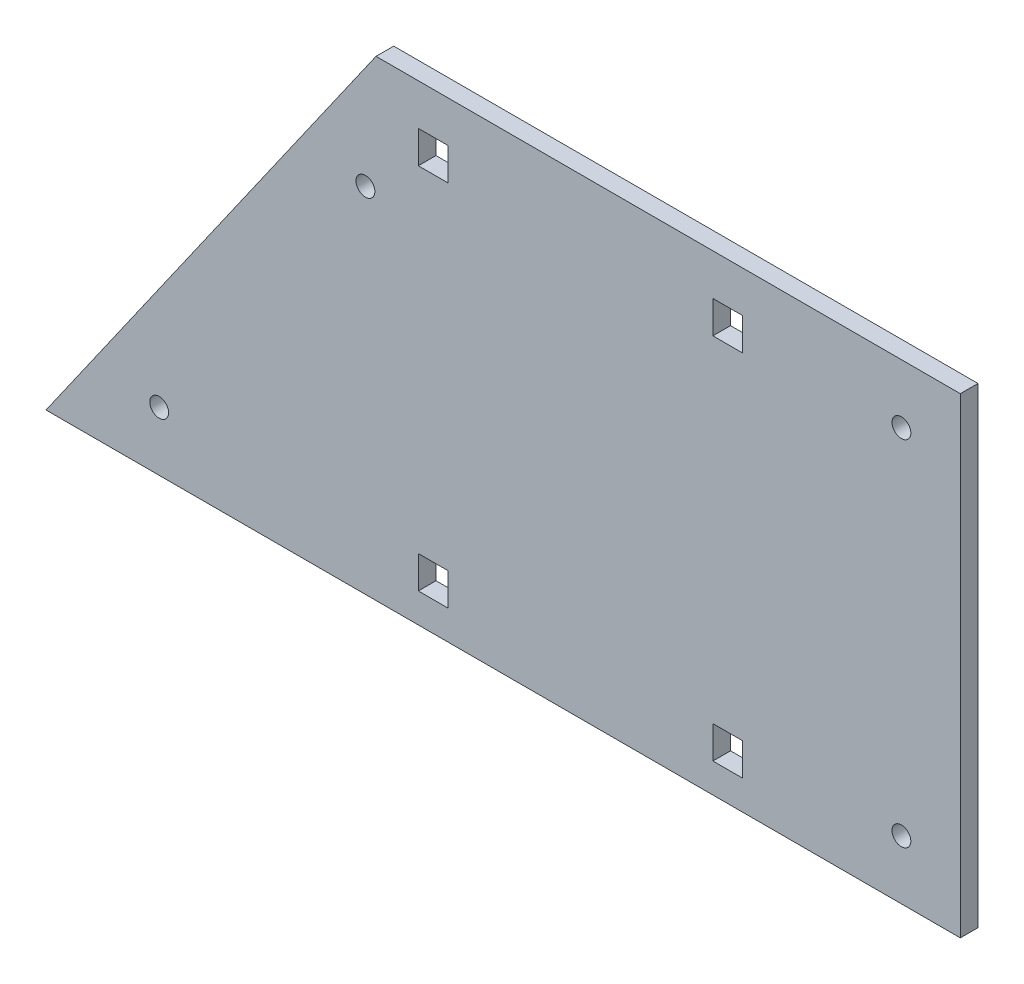
ISO-10303-21;
HEADER;
FILE_DESCRIPTION(('STEP AP214'),'2;1');
FILE_NAME('part.step','',(''),(''),'','','');
FILE_SCHEMA(('AUTOMOTIVE_DESIGN { 1 0 10303 214 1 1 1 1 }'));
ENDSEC;
DATA;
#1=APPLICATION_CONTEXT('core data for automotive mechanical design processes');
#2=APPLICATION_PROTOCOL_DEFINITION('international standard','automotive_design',2000,#1);
#3=PRODUCT_CONTEXT('',#1,'mechanical');
#4=PRODUCT('Part','Part','',(#3));
#5=PRODUCT_RELATED_PRODUCT_CATEGORY('part','',(#4));
#6=PRODUCT_DEFINITION_FORMATION('','',#4);
#7=PRODUCT_DEFINITION_CONTEXT('part definition',#1,'design');
#8=PRODUCT_DEFINITION('design','',#6,#7);
#9=PRODUCT_DEFINITION_SHAPE('','',#8);
#10=(LENGTH_UNIT() NAMED_UNIT(*) SI_UNIT(.MILLI.,.METRE.));
#11=(NAMED_UNIT(*) PLANE_ANGLE_UNIT() SI_UNIT($,.RADIAN.));
#12=(NAMED_UNIT(*) SI_UNIT($,.STERADIAN.) SOLID_ANGLE_UNIT());
#13=UNCERTAINTY_MEASURE_WITH_UNIT(LENGTH_MEASURE(1.E-05),#10,'distance_accuracy_value','');
#14=(GEOMETRIC_REPRESENTATION_CONTEXT(3) GLOBAL_UNCERTAINTY_ASSIGNED_CONTEXT((#13)) GLOBAL_UNIT_ASSIGNED_CONTEXT((#10,
#11,#12)) REPRESENTATION_CONTEXT('',''));
#15=CARTESIAN_POINT('',(0.,0.,0.));
#16=DIRECTION('',(0.,0.,1.));
#17=DIRECTION('',(1.,0.,0.));
#18=AXIS2_PLACEMENT_3D('',#15,#16,#17);
#19=CARTESIAN_POINT('',(0.,0.,3.));
#20=DIRECTION('',(0.,0.,1.));
#21=DIRECTION('',(1.,0.,0.));
#22=AXIS2_PLACEMENT_3D('',#19,#20,#21);
#23=PLANE('',#22);
#24=DIRECTION('',(0.,1.,0.));
#25=VECTOR('',#24,1.);
#26=CARTESIAN_POINT('',(100.749999999974,-37.749999999997,3.));
#27=LINE('',#26,#25);
#28=CARTESIAN_POINT('',(100.749999999974,-37.749999999997,3.));
#29=VERTEX_POINT('',#28);
#30=CARTESIAN_POINT('',(100.749999999974,-32.249999999997,3.));
#31=VERTEX_POINT('',#30);
#32=EDGE_CURVE('E50',#29,#31,#27,.T.);
#33=ORIENTED_EDGE('',*,*,#32,.F.);
#34=DIRECTION('',(1.,0.,0.));
#35=VECTOR('',#34,1.);
#36=CARTESIAN_POINT('',(100.749999999974,-37.749999999997,3.));
#37=LINE('',#36,#35);
#38=CARTESIAN_POINT('',(95.749999999974,-37.749999999997,3.));
#39=VERTEX_POINT('',#38);
#40=EDGE_CURVE('E195',#39,#29,#37,.T.);
#41=ORIENTED_EDGE('',*,*,#40,.F.);
#42=DIRECTION('',(0.,-1.,0.));
#43=VECTOR('',#42,1.);
#44=CARTESIAN_POINT('',(95.749999999974,-37.749999999997,3.));
#45=LINE('',#44,#43);
#46=CARTESIAN_POINT('',(95.749999999974,-32.249999999997,3.));
#47=VERTEX_POINT('',#46);
#48=EDGE_CURVE('E179',#47,#39,#45,.T.);
#49=ORIENTED_EDGE('',*,*,#48,.F.);
#50=DIRECTION('',(-1.,0.,0.));
#51=VECTOR('',#50,1.);
#52=CARTESIAN_POINT('',(100.749999999974,-32.249999999997,3.));
#53=LINE('',#52,#51);
#54=EDGE_CURVE('E189',#31,#47,#53,.T.);
#55=ORIENTED_EDGE('',*,*,#54,.F.);
#56=EDGE_LOOP('',(#33,#41,#49,#55));
#57=FACE_BOUND('',#56,.T.);
#58=DIRECTION('',(0.,1.,0.));
#59=VECTOR('',#58,1.);
#60=CARTESIAN_POINT('',(50.7499999999738,-37.7499999999971,3.));
#61=LINE('',#60,#59);
#62=CARTESIAN_POINT('',(50.7499999999738,-37.7499999999971,3.));
#63=VERTEX_POINT('',#62);
#64=CARTESIAN_POINT('',(50.7499999999738,-32.2499999999971,3.));
#65=VERTEX_POINT('',#64);
#66=EDGE_CURVE('E58',#63,#65,#61,.T.);
#67=ORIENTED_EDGE('',*,*,#66,.F.);
#68=DIRECTION('',(1.,0.,0.));
#69=VECTOR('',#68,1.);
#70=CARTESIAN_POINT('',(50.7499999999738,-37.7499999999971,3.));
#71=LINE('',#70,#69);
#72=CARTESIAN_POINT('',(45.7499999999738,-37.7499999999971,3.));
#73=VERTEX_POINT('',#72);
#74=EDGE_CURVE('E212',#73,#63,#71,.T.);
#75=ORIENTED_EDGE('',*,*,#74,.F.);
#76=DIRECTION('',(0.,-1.,0.));
#77=VECTOR('',#76,1.);
#78=CARTESIAN_POINT('',(45.7499999999738,-37.7499999999971,3.));
#79=LINE('',#78,#77);
#80=CARTESIAN_POINT('',(45.7499999999738,-32.2499999999971,3.));
#81=VERTEX_POINT('',#80);
#82=EDGE_CURVE('E209',#81,#73,#79,.T.);
#83=ORIENTED_EDGE('',*,*,#82,.F.);
#84=DIRECTION('',(-1.,0.,0.));
#85=VECTOR('',#84,1.);
#86=CARTESIAN_POINT('',(50.7499999999738,-32.2499999999971,3.));
#87=LINE('',#86,#85);
#88=EDGE_CURVE('E206',#65,#81,#87,.T.);
#89=ORIENTED_EDGE('',*,*,#88,.F.);
#90=EDGE_LOOP('',(#67,#75,#83,#89));
#91=FACE_BOUND('',#90,.T.);
#92=DIRECTION('',(0.,1.,0.));
#93=VECTOR('',#92,1.);
#94=CARTESIAN_POINT('',(100.749999999972,-100.249999999997,3.));
#95=LINE('',#94,#93);
#96=CARTESIAN_POINT('',(100.749999999972,-100.249999999997,3.));
#97=VERTEX_POINT('',#96);
#98=CARTESIAN_POINT('',(100.749999999972,-94.749999999997,3.));
#99=VERTEX_POINT('',#98);
#100=EDGE_CURVE('E223',#97,#99,#95,.T.);
#101=ORIENTED_EDGE('',*,*,#100,.F.);
#102=DIRECTION('',(1.,0.,0.));
#103=VECTOR('',#102,1.);
#104=CARTESIAN_POINT('',(100.749999999972,-100.249999999997,3.));
#105=LINE('',#104,#103);
#106=CARTESIAN_POINT('',(95.7499999999715,-100.249999999997,3.));
#107=VERTEX_POINT('',#106);
#108=EDGE_CURVE('E232',#107,#97,#105,.T.);
#109=ORIENTED_EDGE('',*,*,#108,.F.);
#110=DIRECTION('',(0.,-1.,0.));
#111=VECTOR('',#110,1.);
#112=CARTESIAN_POINT('',(95.7499999999715,-100.249999999997,3.));
#113=LINE('',#112,#111);
#114=CARTESIAN_POINT('',(95.7499999999715,-94.749999999997,3.));
#115=VERTEX_POINT('',#114);
#116=EDGE_CURVE('E229',#115,#107,#113,.T.);
#117=ORIENTED_EDGE('',*,*,#116,.F.);
#118=DIRECTION('',(-1.,0.,0.));
#119=VECTOR('',#118,1.);
#120=CARTESIAN_POINT('',(100.749999999972,-94.749999999997,3.));
#121=LINE('',#120,#119);
#122=EDGE_CURVE('E225',#99,#115,#121,.T.);
#123=ORIENTED_EDGE('',*,*,#122,.F.);
#124=EDGE_LOOP('',(#101,#109,#117,#123));
#125=FACE_BOUND('',#124,.T.);
#126=DIRECTION('',(0.,1.,0.));
#127=VECTOR('',#126,1.);
#128=CARTESIAN_POINT('',(50.7499999999713,-100.249999999997,3.));
#129=LINE('',#128,#127);
#130=CARTESIAN_POINT('',(50.7499999999713,-100.249999999997,3.));
#131=VERTEX_POINT('',#130);
#132=CARTESIAN_POINT('',(50.7499999999713,-94.7499999999971,3.));
#133=VERTEX_POINT('',#132);
#134=EDGE_CURVE('E202',#131,#133,#129,.T.);
#135=ORIENTED_EDGE('',*,*,#134,.F.);
#136=DIRECTION('',(1.,0.,0.));
#137=VECTOR('',#136,1.);
#138=CARTESIAN_POINT('',(50.7499999999713,-100.249999999997,3.));
#139=LINE('',#138,#137);
#140=CARTESIAN_POINT('',(45.7499999999713,-100.249999999997,3.));
#141=VERTEX_POINT('',#140);
#142=EDGE_CURVE('E252',#141,#131,#139,.T.);
#143=ORIENTED_EDGE('',*,*,#142,.F.);
#144=DIRECTION('',(0.,-1.,0.));
#145=VECTOR('',#144,1.);
#146=CARTESIAN_POINT('',(45.7499999999713,-100.249999999997,3.));
#147=LINE('',#146,#145);
#148=CARTESIAN_POINT('',(45.7499999999713,-94.7499999999971,3.));
#149=VERTEX_POINT('',#148);
#150=EDGE_CURVE('E249',#149,#141,#147,.T.);
#151=ORIENTED_EDGE('',*,*,#150,.F.);
#152=DIRECTION('',(-1.,0.,0.));
#153=VECTOR('',#152,1.);
#154=CARTESIAN_POINT('',(50.7499999999713,-94.7499999999971,3.));
#155=LINE('',#154,#153);
#156=EDGE_CURVE('E246',#133,#149,#155,.T.);
#157=ORIENTED_EDGE('',*,*,#156,.F.);
#158=EDGE_LOOP('',(#135,#143,#151,#157));
#159=FACE_BOUND('',#158,.T.);
#160=CARTESIAN_POINT('',(127.749999999971,-35.25,3.));
#161=DIRECTION('',(0.,0.,1.));
#162=DIRECTION('',(1.,0.,0.));
#163=AXIS2_PLACEMENT_3D('',#160,#161,#162);
#164=CIRCLE('',#163,1.59999999999999);
#165=CARTESIAN_POINT('',(129.349999999971,-35.25,3.));
#166=VERTEX_POINT('',#165);
#167=EDGE_CURVE('E269',#166,#166,#164,.T.);
#168=ORIENTED_EDGE('',*,*,#167,.F.);
#169=EDGE_LOOP('',(#168));
#170=FACE_BOUND('',#169,.T.);
#171=CARTESIAN_POINT('',(36.7735951233743,-45.2500000000001,3.));
#172=DIRECTION('',(0.,0.,1.));
#173=DIRECTION('',(1.,0.,0.));
#174=AXIS2_PLACEMENT_3D('',#171,#172,#173);
#175=CIRCLE('',#174,1.6);
#176=CARTESIAN_POINT('',(38.3735951233743,-45.2500000000001,3.));
#177=VERTEX_POINT('',#176);
#178=EDGE_CURVE('E281',#177,#177,#175,.T.);
#179=ORIENTED_EDGE('',*,*,#178,.F.);
#180=EDGE_LOOP('',(#179));
#181=FACE_BOUND('',#180,.T.);
#182=DIRECTION('',(0.,1.,0.));
#183=VECTOR('',#182,1.);
#184=CARTESIAN_POINT('',(137.749999999971,-25.25,3.));
#185=LINE('',#184,#183);
#186=CARTESIAN_POINT('',(137.749999999968,-105.25,3.));
#187=VERTEX_POINT('',#186);
#188=CARTESIAN_POINT('',(137.749999999971,-25.25,3.));
#189=VERTEX_POINT('',#188);
#190=EDGE_CURVE('E287',#187,#189,#185,.T.);
#191=ORIENTED_EDGE('',*,*,#190,.T.);
#192=DIRECTION('',(-1.,0.,0.));
#193=VECTOR('',#192,1.);
#194=CARTESIAN_POINT('',(137.749999999971,-25.25,3.));
#195=LINE('',#194,#193);
#196=CARTESIAN_POINT('',(38.569999999954,-25.25,3.));
#197=VERTEX_POINT('',#196);
#198=EDGE_CURVE('E290',#189,#197,#195,.T.);
#199=ORIENTED_EDGE('',*,*,#198,.T.);
#200=DIRECTION('',(-0.573576436351044,-0.819152044288993,0.));
#201=VECTOR('',#200,1.);
#202=CARTESIAN_POINT('',(38.569999999954,-25.25,3.));
#203=LINE('',#202,#201);
#204=CARTESIAN_POINT('',(-17.4466030568225,-105.25,3.));
#205=VERTEX_POINT('',#204);
#206=EDGE_CURVE('E293',#197,#205,#203,.T.);
#207=ORIENTED_EDGE('',*,*,#206,.T.);
#208=DIRECTION('',(1.,0.,0.));
#209=VECTOR('',#208,1.);
#210=CARTESIAN_POINT('',(-17.4466030568225,-105.25,3.));
#211=LINE('',#210,#209);
#212=EDGE_CURVE('E295',#205,#187,#211,.T.);
#213=ORIENTED_EDGE('',*,*,#212,.T.);
#214=EDGE_LOOP('',(#191,#199,#207,#213));
#215=FACE_BOUND('',#214,.T.);
#216=CARTESIAN_POINT('',(1.76321821288909,-95.25,3.));
#217=DIRECTION('',(0.,0.,1.));
#218=DIRECTION('',(1.,0.,0.));
#219=AXIS2_PLACEMENT_3D('',#216,#217,#218);
#220=CIRCLE('',#219,1.60000000000001);
#221=CARTESIAN_POINT('',(3.36321821288909,-95.25,3.));
#222=VERTEX_POINT('',#221);
#223=EDGE_CURVE('E275',#222,#222,#220,.T.);
#224=ORIENTED_EDGE('',*,*,#223,.F.);
#225=EDGE_LOOP('',(#224));
#226=FACE_BOUND('',#225,.T.);
#227=CARTESIAN_POINT('',(127.749999999971,-95.25,3.));
#228=DIRECTION('',(0.,0.,1.));
#229=DIRECTION('',(1.,0.,0.));
#230=AXIS2_PLACEMENT_3D('',#227,#228,#229);
#231=CIRCLE('',#230,1.59999999999999);
#232=CARTESIAN_POINT('',(129.349999999971,-95.25,3.));
#233=VERTEX_POINT('',#232);
#234=EDGE_CURVE('E263',#233,#233,#231,.T.);
#235=ORIENTED_EDGE('',*,*,#234,.F.);
#236=EDGE_LOOP('',(#235));
#237=FACE_BOUND('',#236,.T.);
#238=ADVANCED_FACE('F35',(#57,#91,#125,#159,#170,#181,#215,#226,#237),#23,.T.);
#239=CARTESIAN_POINT('',(0.,0.,0.));
#240=DIRECTION('',(0.,0.,1.));
#241=DIRECTION('',(1.,0.,0.));
#242=AXIS2_PLACEMENT_3D('',#239,#240,#241);
#243=PLANE('',#242);
#244=DIRECTION('',(1.,0.,0.));
#245=VECTOR('',#244,1.);
#246=CARTESIAN_POINT('',(0.,-37.749999999997,0.));
#247=LINE('',#246,#245);
#248=CARTESIAN_POINT('',(95.749999999974,-37.749999999997,0.));
#249=VERTEX_POINT('',#248);
#250=CARTESIAN_POINT('',(100.749999999974,-37.749999999997,0.));
#251=VERTEX_POINT('',#250);
#252=EDGE_CURVE('E43',#249,#251,#247,.T.);
#253=ORIENTED_EDGE('',*,*,#252,.T.);
#254=DIRECTION('',(0.,1.,0.));
#255=VECTOR('',#254,1.);
#256=CARTESIAN_POINT('',(100.749999999974,0.,0.));
#257=LINE('',#256,#255);
#258=CARTESIAN_POINT('',(100.749999999974,-32.249999999997,0.));
#259=VERTEX_POINT('',#258);
#260=EDGE_CURVE('E11',#251,#259,#257,.T.);
#261=ORIENTED_EDGE('',*,*,#260,.T.);
#262=DIRECTION('',(-1.,0.,0.));
#263=VECTOR('',#262,1.);
#264=CARTESIAN_POINT('',(1.79023462720793E-13,-32.2499999999975,0.));
#265=LINE('',#264,#263);
#266=CARTESIAN_POINT('',(95.749999999974,-32.249999999997,0.));
#267=VERTEX_POINT('',#266);
#268=EDGE_CURVE('E352',#259,#267,#265,.T.);
#269=ORIENTED_EDGE('',*,*,#268,.T.);
#270=DIRECTION('',(0.,-1.,0.));
#271=VECTOR('',#270,1.);
#272=CARTESIAN_POINT('',(95.749999999974,0.,0.));
#273=LINE('',#272,#271);
#274=EDGE_CURVE('E182',#267,#249,#273,.T.);
#275=ORIENTED_EDGE('',*,*,#274,.T.);
#276=EDGE_LOOP('',(#253,#261,#269,#275));
#277=FACE_BOUND('',#276,.T.);
#278=DIRECTION('',(1.,0.,0.));
#279=VECTOR('',#278,1.);
#280=CARTESIAN_POINT('',(-2.0955459589798E-13,-37.7499999999969,0.));
#281=LINE('',#280,#279);
#282=CARTESIAN_POINT('',(45.7499999999738,-37.7499999999971,0.));
#283=VERTEX_POINT('',#282);
#284=CARTESIAN_POINT('',(50.7499999999738,-37.7499999999971,0.));
#285=VERTEX_POINT('',#284);
#286=EDGE_CURVE('E346',#283,#285,#281,.T.);
#287=ORIENTED_EDGE('',*,*,#286,.T.);
#288=DIRECTION('',(0.,1.,0.));
#289=VECTOR('',#288,1.);
#290=CARTESIAN_POINT('',(50.7499999999738,0.,0.));
#291=LINE('',#290,#289);
#292=CARTESIAN_POINT('',(50.7499999999738,-32.2499999999971,0.));
#293=VERTEX_POINT('',#292);
#294=EDGE_CURVE('E349',#285,#293,#291,.T.);
#295=ORIENTED_EDGE('',*,*,#294,.T.);
#296=DIRECTION('',(-1.,0.,0.));
#297=VECTOR('',#296,1.);
#298=CARTESIAN_POINT('',(0.,-32.2499999999971,0.));
#299=LINE('',#298,#297);
#300=CARTESIAN_POINT('',(45.7499999999738,-32.2499999999971,0.));
#301=VERTEX_POINT('',#300);
#302=EDGE_CURVE('E340',#293,#301,#299,.T.);
#303=ORIENTED_EDGE('',*,*,#302,.T.);
#304=DIRECTION('',(0.,-1.,0.));
#305=VECTOR('',#304,1.);
#306=CARTESIAN_POINT('',(45.7499999999738,0.,0.));
#307=LINE('',#306,#305);
#308=EDGE_CURVE('E343',#301,#283,#307,.T.);
#309=ORIENTED_EDGE('',*,*,#308,.T.);
#310=EDGE_LOOP('',(#287,#295,#303,#309));
#311=FACE_BOUND('',#310,.T.);
#312=DIRECTION('',(1.,0.,0.));
#313=VECTOR('',#312,1.);
#314=CARTESIAN_POINT('',(0.,-100.249999999997,0.));
#315=LINE('',#314,#313);
#316=CARTESIAN_POINT('',(95.7499999999715,-100.249999999997,0.));
#317=VERTEX_POINT('',#316);
#318=CARTESIAN_POINT('',(100.749999999972,-100.249999999997,0.));
#319=VERTEX_POINT('',#318);
#320=EDGE_CURVE('E334',#317,#319,#315,.T.);
#321=ORIENTED_EDGE('',*,*,#320,.T.);
#322=DIRECTION('',(0.,1.,0.));
#323=VECTOR('',#322,1.);
#324=CARTESIAN_POINT('',(100.749999999972,0.,0.));
#325=LINE('',#324,#323);
#326=CARTESIAN_POINT('',(100.749999999972,-94.749999999997,0.));
#327=VERTEX_POINT('',#326);
#328=EDGE_CURVE('E337',#319,#327,#325,.T.);
#329=ORIENTED_EDGE('',*,*,#328,.T.);
#330=DIRECTION('',(-1.,0.,0.));
#331=VECTOR('',#330,1.);
#332=CARTESIAN_POINT('',(5.25968157916154E-13,-94.7499999999975,0.));
#333=LINE('',#332,#331);
#334=CARTESIAN_POINT('',(95.7499999999715,-94.749999999997,0.));
#335=VERTEX_POINT('',#334);
#336=EDGE_CURVE('E328',#327,#335,#333,.T.);
#337=ORIENTED_EDGE('',*,*,#336,.T.);
#338=DIRECTION('',(0.,-1.,0.));
#339=VECTOR('',#338,1.);
#340=CARTESIAN_POINT('',(95.7499999999715,0.,0.));
#341=LINE('',#340,#339);
#342=EDGE_CURVE('E331',#335,#317,#341,.T.);
#343=ORIENTED_EDGE('',*,*,#342,.T.);
#344=EDGE_LOOP('',(#321,#329,#337,#343));
#345=FACE_BOUND('',#344,.T.);
#346=DIRECTION('',(1.,0.,0.));
#347=VECTOR('',#346,1.);
#348=CARTESIAN_POINT('',(-5.56499291093339E-13,-100.249999999997,0.));
#349=LINE('',#348,#347);
#350=CARTESIAN_POINT('',(45.7499999999713,-100.249999999997,0.));
#351=VERTEX_POINT('',#350);
#352=CARTESIAN_POINT('',(50.7499999999713,-100.249999999997,0.));
#353=VERTEX_POINT('',#352);
#354=EDGE_CURVE('E322',#351,#353,#349,.T.);
#355=ORIENTED_EDGE('',*,*,#354,.T.);
#356=DIRECTION('',(0.,1.,0.));
#357=VECTOR('',#356,1.);
#358=CARTESIAN_POINT('',(50.7499999999713,0.,0.));
#359=LINE('',#358,#357);
#360=CARTESIAN_POINT('',(50.7499999999713,-94.7499999999971,0.));
#361=VERTEX_POINT('',#360);
#362=EDGE_CURVE('E325',#353,#361,#359,.T.);
#363=ORIENTED_EDGE('',*,*,#362,.T.);
#364=DIRECTION('',(-1.,0.,0.));
#365=VECTOR('',#364,1.);
#366=CARTESIAN_POINT('',(0.,-94.7499999999971,0.));
#367=LINE('',#366,#365);
#368=CARTESIAN_POINT('',(45.7499999999713,-94.7499999999971,0.));
#369=VERTEX_POINT('',#368);
#370=EDGE_CURVE('E316',#361,#369,#367,.T.);
#371=ORIENTED_EDGE('',*,*,#370,.T.);
#372=DIRECTION('',(0.,-1.,0.));
#373=VECTOR('',#372,1.);
#374=CARTESIAN_POINT('',(45.7499999999713,0.,0.));
#375=LINE('',#374,#373);
#376=EDGE_CURVE('E319',#369,#351,#375,.T.);
#377=ORIENTED_EDGE('',*,*,#376,.T.);
#378=EDGE_LOOP('',(#355,#363,#371,#377));
#379=FACE_BOUND('',#378,.T.);
#380=DIRECTION('',(0.,1.,0.));
#381=VECTOR('',#380,1.);
#382=CARTESIAN_POINT('',(137.749999999971,-25.25,0.));
#383=LINE('',#382,#381);
#384=CARTESIAN_POINT('',(137.749999999968,-105.25,0.));
#385=VERTEX_POINT('',#384);
#386=CARTESIAN_POINT('',(137.749999999971,-25.25,0.));
#387=VERTEX_POINT('',#386);
#388=EDGE_CURVE('E284',#385,#387,#383,.T.);
#389=ORIENTED_EDGE('',*,*,#388,.F.);
#390=DIRECTION('',(1.,0.,0.));
#391=VECTOR('',#390,1.);
#392=CARTESIAN_POINT('',(-17.4466030568225,-105.25,0.));
#393=LINE('',#392,#391);
#394=CARTESIAN_POINT('',(-17.4466030568225,-105.25,0.));
#395=VERTEX_POINT('',#394);
#396=EDGE_CURVE('E291',#395,#385,#393,.T.);
#397=ORIENTED_EDGE('',*,*,#396,.F.);
#398=DIRECTION('',(-0.573576436351044,-0.819152044288993,0.));
#399=VECTOR('',#398,1.);
#400=CARTESIAN_POINT('',(38.569999999954,-25.25,0.));
#401=LINE('',#400,#399);
#402=CARTESIAN_POINT('',(38.569999999954,-25.25,0.));
#403=VERTEX_POINT('',#402);
#404=EDGE_CURVE('E302',#403,#395,#401,.T.);
#405=ORIENTED_EDGE('',*,*,#404,.F.);
#406=DIRECTION('',(-1.,0.,0.));
#407=VECTOR('',#406,1.);
#408=CARTESIAN_POINT('',(137.749999999971,-25.25,0.));
#409=LINE('',#408,#407);
#410=EDGE_CURVE('E300',#387,#403,#409,.T.);
#411=ORIENTED_EDGE('',*,*,#410,.F.);
#412=EDGE_LOOP('',(#389,#397,#405,#411));
#413=FACE_BOUND('',#412,.T.);
#414=CARTESIAN_POINT('',(36.7735951233743,-45.2500000000001,0.));
#415=DIRECTION('',(0.,0.,1.));
#416=DIRECTION('',(1.,0.,0.));
#417=AXIS2_PLACEMENT_3D('',#414,#415,#416);
#418=CIRCLE('',#417,1.6);
#419=CARTESIAN_POINT('',(38.3735951233743,-45.2500000000001,0.));
#420=VERTEX_POINT('',#419);
#421=EDGE_CURVE('E278',#420,#420,#418,.T.);
#422=ORIENTED_EDGE('',*,*,#421,.T.);
#423=EDGE_LOOP('',(#422));
#424=FACE_BOUND('',#423,.T.);
#425=CARTESIAN_POINT('',(1.76321821288909,-95.25,0.));
#426=DIRECTION('',(0.,0.,1.));
#427=DIRECTION('',(1.,0.,0.));
#428=AXIS2_PLACEMENT_3D('',#425,#426,#427);
#429=CIRCLE('',#428,1.60000000000001);
#430=CARTESIAN_POINT('',(3.36321821288909,-95.25,0.));
#431=VERTEX_POINT('',#430);
#432=EDGE_CURVE('E272',#431,#431,#429,.T.);
#433=ORIENTED_EDGE('',*,*,#432,.T.);
#434=EDGE_LOOP('',(#433));
#435=FACE_BOUND('',#434,.T.);
#436=CARTESIAN_POINT('',(127.749999999971,-35.25,0.));
#437=DIRECTION('',(0.,0.,1.));
#438=DIRECTION('',(1.,0.,0.));
#439=AXIS2_PLACEMENT_3D('',#436,#437,#438);
#440=CIRCLE('',#439,1.59999999999999);
#441=CARTESIAN_POINT('',(129.349999999971,-35.25,0.));
#442=VERTEX_POINT('',#441);
#443=EDGE_CURVE('E266',#442,#442,#440,.T.);
#444=ORIENTED_EDGE('',*,*,#443,.T.);
#445=EDGE_LOOP('',(#444));
#446=FACE_BOUND('',#445,.T.);
#447=CARTESIAN_POINT('',(127.749999999971,-95.25,0.));
#448=DIRECTION('',(0.,0.,1.));
#449=DIRECTION('',(1.,0.,0.));
#450=AXIS2_PLACEMENT_3D('',#447,#448,#449);
#451=CIRCLE('',#450,1.59999999999999);
#452=CARTESIAN_POINT('',(129.349999999971,-95.25,0.));
#453=VERTEX_POINT('',#452);
#454=EDGE_CURVE('E238',#453,#453,#451,.T.);
#455=ORIENTED_EDGE('',*,*,#454,.T.);
#456=EDGE_LOOP('',(#455));
#457=FACE_BOUND('',#456,.T.);
#458=ADVANCED_FACE('F356',(#277,#311,#345,#379,#413,#424,#435,#446,#457),#243,.F.);
#459=CARTESIAN_POINT('',(137.749999999971,-25.25,3.));
#460=DIRECTION('',(-1.,0.,0.));
#461=DIRECTION('',(0.,-1.,0.));
#462=AXIS2_PLACEMENT_3D('',#459,#460,#461);
#463=PLANE('',#462);
#464=ORIENTED_EDGE('',*,*,#388,.T.);
#465=DIRECTION('',(0.,0.,-1.));
#466=VECTOR('',#465,1.);
#467=CARTESIAN_POINT('',(137.749999999971,-25.25,3.));
#468=LINE('',#467,#466);
#469=EDGE_CURVE('E313',#189,#387,#468,.T.);
#470=ORIENTED_EDGE('',*,*,#469,.F.);
#471=ORIENTED_EDGE('',*,*,#190,.F.);
#472=DIRECTION('',(0.,0.,-1.));
#473=VECTOR('',#472,1.);
#474=CARTESIAN_POINT('',(137.749999999968,-105.25,3.));
#475=LINE('',#474,#473);
#476=EDGE_CURVE('E297',#187,#385,#475,.T.);
#477=ORIENTED_EDGE('',*,*,#476,.T.);
#478=EDGE_LOOP('',(#464,#470,#471,#477));
#479=FACE_BOUND('',#478,.T.);
#480=ADVANCED_FACE('F37',(#479),#463,.F.);
#481=CARTESIAN_POINT('',(137.749999999971,-25.25,3.));
#482=DIRECTION('',(0.,-1.,0.));
#483=DIRECTION('',(0.,0.,-1.));
#484=AXIS2_PLACEMENT_3D('',#481,#482,#483);
#485=PLANE('',#484);
#486=ORIENTED_EDGE('',*,*,#410,.T.);
#487=DIRECTION('',(0.,0.,-1.));
#488=VECTOR('',#487,1.);
#489=CARTESIAN_POINT('',(38.569999999954,-25.25,3.));
#490=LINE('',#489,#488);
#491=EDGE_CURVE('E310',#197,#403,#490,.T.);
#492=ORIENTED_EDGE('',*,*,#491,.F.);
#493=ORIENTED_EDGE('',*,*,#198,.F.);
#494=ORIENTED_EDGE('',*,*,#469,.T.);
#495=EDGE_LOOP('',(#486,#492,#493,#494));
#496=FACE_BOUND('',#495,.T.);
#497=ADVANCED_FACE('F392',(#496),#485,.F.);
#498=CARTESIAN_POINT('',(38.569999999954,-25.25,3.));
#499=DIRECTION('',(0.819152044288993,-0.573576436351044,0.));
#500=DIRECTION('',(0.573576436351044,0.819152044288994,0.));
#501=AXIS2_PLACEMENT_3D('',#498,#499,#500);
#502=PLANE('',#501);
#503=ORIENTED_EDGE('',*,*,#404,.T.);
#504=DIRECTION('',(0.,0.,-1.));
#505=VECTOR('',#504,1.);
#506=CARTESIAN_POINT('',(-17.4466030568225,-105.25,3.));
#507=LINE('',#506,#505);
#508=EDGE_CURVE('E307',#205,#395,#507,.T.);
#509=ORIENTED_EDGE('',*,*,#508,.F.);
#510=ORIENTED_EDGE('',*,*,#206,.F.);
#511=ORIENTED_EDGE('',*,*,#491,.T.);
#512=EDGE_LOOP('',(#503,#509,#510,#511));
#513=FACE_BOUND('',#512,.T.);
#514=ADVANCED_FACE('F389',(#513),#502,.F.);
#515=CARTESIAN_POINT('',(-17.4466030568225,-105.25,3.));
#516=DIRECTION('',(0.,1.,0.));
#517=DIRECTION('',(0.,0.,1.));
#518=AXIS2_PLACEMENT_3D('',#515,#516,#517);
#519=PLANE('',#518);
#520=ORIENTED_EDGE('',*,*,#396,.T.);
#521=ORIENTED_EDGE('',*,*,#476,.F.);
#522=ORIENTED_EDGE('',*,*,#212,.F.);
#523=ORIENTED_EDGE('',*,*,#508,.T.);
#524=EDGE_LOOP('',(#520,#521,#522,#523));
#525=FACE_BOUND('',#524,.T.);
#526=ADVANCED_FACE('F386',(#525),#519,.F.);
#527=CARTESIAN_POINT('',(36.7735951233743,-45.2500000000001,3.));
#528=DIRECTION('',(0.,0.,-1.));
#529=DIRECTION('',(-1.,0.,0.));
#530=AXIS2_PLACEMENT_3D('',#527,#528,#529);
#531=CYLINDRICAL_SURFACE('',#530,1.6);
#532=ORIENTED_EDGE('',*,*,#178,.T.);
#533=EDGE_LOOP('',(#532));
#534=FACE_BOUND('',#533,.T.);
#535=ORIENTED_EDGE('',*,*,#421,.F.);
#536=EDGE_LOOP('',(#535));
#537=FACE_BOUND('',#536,.T.);
#538=ADVANCED_FACE('F383',(#534,#537),#531,.F.);
#539=CARTESIAN_POINT('',(1.76321821288909,-95.25,3.));
#540=DIRECTION('',(0.,0.,-1.));
#541=DIRECTION('',(-1.,0.,0.));
#542=AXIS2_PLACEMENT_3D('',#539,#540,#541);
#543=CYLINDRICAL_SURFACE('',#542,1.60000000000001);
#544=ORIENTED_EDGE('',*,*,#223,.T.);
#545=EDGE_LOOP('',(#544));
#546=FACE_BOUND('',#545,.T.);
#547=ORIENTED_EDGE('',*,*,#432,.F.);
#548=EDGE_LOOP('',(#547));
#549=FACE_BOUND('',#548,.T.);
#550=ADVANCED_FACE('F433',(#546,#549),#543,.F.);
#551=CARTESIAN_POINT('',(127.749999999971,-35.25,3.));
#552=DIRECTION('',(0.,0.,-1.));
#553=DIRECTION('',(-1.,0.,0.));
#554=AXIS2_PLACEMENT_3D('',#551,#552,#553);
#555=CYLINDRICAL_SURFACE('',#554,1.59999999999999);
#556=ORIENTED_EDGE('',*,*,#167,.T.);
#557=EDGE_LOOP('',(#556));
#558=FACE_BOUND('',#557,.T.);
#559=ORIENTED_EDGE('',*,*,#443,.F.);
#560=EDGE_LOOP('',(#559));
#561=FACE_BOUND('',#560,.T.);
#562=ADVANCED_FACE('F422',(#558,#561),#555,.F.);
#563=CARTESIAN_POINT('',(127.749999999971,-95.25,3.));
#564=DIRECTION('',(0.,0.,-1.));
#565=DIRECTION('',(-1.,0.,0.));
#566=AXIS2_PLACEMENT_3D('',#563,#564,#565);
#567=CYLINDRICAL_SURFACE('',#566,1.59999999999999);
#568=ORIENTED_EDGE('',*,*,#234,.T.);
#569=EDGE_LOOP('',(#568));
#570=FACE_BOUND('',#569,.T.);
#571=ORIENTED_EDGE('',*,*,#454,.F.);
#572=EDGE_LOOP('',(#571));
#573=FACE_BOUND('',#572,.T.);
#574=ADVANCED_FACE('F418',(#570,#573),#567,.F.);
#575=CARTESIAN_POINT('',(50.7499999999713,-100.249999999997,-2.));
#576=DIRECTION('',(1.,0.,0.));
#577=DIRECTION('',(0.,0.,-1.));
#578=AXIS2_PLACEMENT_3D('',#575,#576,#577);
#579=PLANE('',#578);
#580=DIRECTION('',(0.,0.,1.));
#581=VECTOR('',#580,1.);
#582=CARTESIAN_POINT('',(50.7499999999713,-100.249999999997,-2.));
#583=LINE('',#582,#581);
#584=EDGE_CURVE('E226',#353,#131,#583,.T.);
#585=ORIENTED_EDGE('',*,*,#584,.T.);
#586=ORIENTED_EDGE('',*,*,#134,.T.);
#587=DIRECTION('',(0.,0.,1.));
#588=VECTOR('',#587,1.);
#589=CARTESIAN_POINT('',(50.7499999999713,-94.7499999999971,-2.));
#590=LINE('',#589,#588);
#591=EDGE_CURVE('E255',#361,#133,#590,.T.);
#592=ORIENTED_EDGE('',*,*,#591,.F.);
#593=ORIENTED_EDGE('',*,*,#362,.F.);
#594=EDGE_LOOP('',(#585,#586,#592,#593));
#595=FACE_BOUND('',#594,.T.);
#596=ADVANCED_FACE('F421',(#595),#579,.F.);
#597=CARTESIAN_POINT('',(50.7499999999713,-100.249999999997,-2.));
#598=DIRECTION('',(0.,-1.,0.));
#599=DIRECTION('',(1.,0.,0.));
#600=AXIS2_PLACEMENT_3D('',#597,#598,#599);
#601=PLANE('',#600);
#602=DIRECTION('',(0.,0.,1.));
#603=VECTOR('',#602,1.);
#604=CARTESIAN_POINT('',(45.7499999999713,-100.249999999997,-2.));
#605=LINE('',#604,#603);
#606=EDGE_CURVE('E257',#351,#141,#605,.T.);
#607=ORIENTED_EDGE('',*,*,#606,.T.);
#608=ORIENTED_EDGE('',*,*,#142,.T.);
#609=ORIENTED_EDGE('',*,*,#584,.F.);
#610=ORIENTED_EDGE('',*,*,#354,.F.);
#611=EDGE_LOOP('',(#607,#608,#609,#610));
#612=FACE_BOUND('',#611,.T.);
#613=ADVANCED_FACE('F430',(#612),#601,.F.);
#614=CARTESIAN_POINT('',(45.7499999999713,-100.249999999997,-2.));
#615=DIRECTION('',(-1.,0.,0.));
#616=DIRECTION('',(0.,0.,1.));
#617=AXIS2_PLACEMENT_3D('',#614,#615,#616);
#618=PLANE('',#617);
#619=DIRECTION('',(0.,0.,1.));
#620=VECTOR('',#619,1.);
#621=CARTESIAN_POINT('',(45.7499999999713,-94.7499999999971,-2.));
#622=LINE('',#621,#620);
#623=EDGE_CURVE('E259',#369,#149,#622,.T.);
#624=ORIENTED_EDGE('',*,*,#623,.T.);
#625=ORIENTED_EDGE('',*,*,#150,.T.);
#626=ORIENTED_EDGE('',*,*,#606,.F.);
#627=ORIENTED_EDGE('',*,*,#376,.F.);
#628=EDGE_LOOP('',(#624,#625,#626,#627));
#629=FACE_BOUND('',#628,.T.);
#630=ADVANCED_FACE('F566',(#629),#618,.F.);
#631=CARTESIAN_POINT('',(50.7499999999713,-94.7499999999971,-2.));
#632=DIRECTION('',(0.,1.,0.));
#633=DIRECTION('',(0.,0.,1.));
#634=AXIS2_PLACEMENT_3D('',#631,#632,#633);
#635=PLANE('',#634);
#636=ORIENTED_EDGE('',*,*,#591,.T.);
#637=ORIENTED_EDGE('',*,*,#156,.T.);
#638=ORIENTED_EDGE('',*,*,#623,.F.);
#639=ORIENTED_EDGE('',*,*,#370,.F.);
#640=EDGE_LOOP('',(#636,#637,#638,#639));
#641=FACE_BOUND('',#640,.T.);
#642=ADVANCED_FACE('F562',(#641),#635,.F.);
#643=CARTESIAN_POINT('',(100.749999999972,-100.249999999997,-2.));
#644=DIRECTION('',(1.,0.,0.));
#645=DIRECTION('',(0.,0.,-1.));
#646=AXIS2_PLACEMENT_3D('',#643,#644,#645);
#647=PLANE('',#646);
#648=DIRECTION('',(0.,0.,1.));
#649=VECTOR('',#648,1.);
#650=CARTESIAN_POINT('',(100.749999999972,-100.249999999997,-2.));
#651=LINE('',#650,#649);
#652=EDGE_CURVE('E236',#319,#97,#651,.T.);
#653=ORIENTED_EDGE('',*,*,#652,.T.);
#654=ORIENTED_EDGE('',*,*,#100,.T.);
#655=DIRECTION('',(0.,0.,1.));
#656=VECTOR('',#655,1.);
#657=CARTESIAN_POINT('',(100.749999999972,-94.749999999997,-2.));
#658=LINE('',#657,#656);
#659=EDGE_CURVE('E235',#327,#99,#658,.T.);
#660=ORIENTED_EDGE('',*,*,#659,.F.);
#661=ORIENTED_EDGE('',*,*,#328,.F.);
#662=EDGE_LOOP('',(#653,#654,#660,#661));
#663=FACE_BOUND('',#662,.T.);
#664=ADVANCED_FACE('F553',(#663),#647,.F.);
#665=CARTESIAN_POINT('',(100.749999999972,-100.249999999997,-2.));
#666=DIRECTION('',(0.,-1.,0.));
#667=DIRECTION('',(0.,0.,-1.));
#668=AXIS2_PLACEMENT_3D('',#665,#666,#667);
#669=PLANE('',#668);
#670=DIRECTION('',(0.,0.,1.));
#671=VECTOR('',#670,1.);
#672=CARTESIAN_POINT('',(95.7499999999715,-100.249999999997,-2.));
#673=LINE('',#672,#671);
#674=EDGE_CURVE('E239',#317,#107,#673,.T.);
#675=ORIENTED_EDGE('',*,*,#674,.T.);
#676=ORIENTED_EDGE('',*,*,#108,.T.);
#677=ORIENTED_EDGE('',*,*,#652,.F.);
#678=ORIENTED_EDGE('',*,*,#320,.F.);
#679=EDGE_LOOP('',(#675,#676,#677,#678));
#680=FACE_BOUND('',#679,.T.);
#681=ADVANCED_FACE('F549',(#680),#669,.F.);
#682=CARTESIAN_POINT('',(95.7499999999715,-100.249999999997,-2.));
#683=DIRECTION('',(-1.,0.,0.));
#684=DIRECTION('',(0.,0.,1.));
#685=AXIS2_PLACEMENT_3D('',#682,#683,#684);
#686=PLANE('',#685);
#687=DIRECTION('',(0.,0.,1.));
#688=VECTOR('',#687,1.);
#689=CARTESIAN_POINT('',(95.7499999999715,-94.749999999997,-2.));
#690=LINE('',#689,#688);
#691=EDGE_CURVE('E241',#335,#115,#690,.T.);
#692=ORIENTED_EDGE('',*,*,#691,.T.);
#693=ORIENTED_EDGE('',*,*,#116,.T.);
#694=ORIENTED_EDGE('',*,*,#674,.F.);
#695=ORIENTED_EDGE('',*,*,#342,.F.);
#696=EDGE_LOOP('',(#692,#693,#694,#695));
#697=FACE_BOUND('',#696,.T.);
#698=ADVANCED_FACE('F552',(#697),#686,.F.);
#699=CARTESIAN_POINT('',(100.749999999972,-94.749999999997,-2.));
#700=DIRECTION('',(0.,1.,0.));
#701=DIRECTION('',(-1.,0.,0.));
#702=AXIS2_PLACEMENT_3D('',#699,#700,#701);
#703=PLANE('',#702);
#704=ORIENTED_EDGE('',*,*,#659,.T.);
#705=ORIENTED_EDGE('',*,*,#122,.T.);
#706=ORIENTED_EDGE('',*,*,#691,.F.);
#707=ORIENTED_EDGE('',*,*,#336,.F.);
#708=EDGE_LOOP('',(#704,#705,#706,#707));
#709=FACE_BOUND('',#708,.T.);
#710=ADVANCED_FACE('F494',(#709),#703,.F.);
#711=CARTESIAN_POINT('',(50.7499999999738,-37.7499999999971,-2.));
#712=DIRECTION('',(1.,0.,0.));
#713=DIRECTION('',(0.,0.,-1.));
#714=AXIS2_PLACEMENT_3D('',#711,#712,#713);
#715=PLANE('',#714);
#716=DIRECTION('',(0.,0.,1.));
#717=VECTOR('',#716,1.);
#718=CARTESIAN_POINT('',(50.7499999999738,-37.7499999999971,-2.));
#719=LINE('',#718,#717);
#720=EDGE_CURVE('E216',#285,#63,#719,.T.);
#721=ORIENTED_EDGE('',*,*,#720,.T.);
#722=ORIENTED_EDGE('',*,*,#66,.T.);
#723=DIRECTION('',(0.,0.,1.));
#724=VECTOR('',#723,1.);
#725=CARTESIAN_POINT('',(50.7499999999738,-32.2499999999971,-2.));
#726=LINE('',#725,#724);
#727=EDGE_CURVE('E215',#293,#65,#726,.T.);
#728=ORIENTED_EDGE('',*,*,#727,.F.);
#729=ORIENTED_EDGE('',*,*,#294,.F.);
#730=EDGE_LOOP('',(#721,#722,#728,#729));
#731=FACE_BOUND('',#730,.T.);
#732=ADVANCED_FACE('F488',(#731),#715,.F.);
#733=CARTESIAN_POINT('',(50.7499999999738,-37.7499999999971,-2.));
#734=DIRECTION('',(0.,-1.,0.));
#735=DIRECTION('',(1.,0.,0.));
#736=AXIS2_PLACEMENT_3D('',#733,#734,#735);
#737=PLANE('',#736);
#738=DIRECTION('',(0.,0.,1.));
#739=VECTOR('',#738,1.);
#740=CARTESIAN_POINT('',(45.7499999999738,-37.7499999999971,-2.));
#741=LINE('',#740,#739);
#742=EDGE_CURVE('E218',#283,#73,#741,.T.);
#743=ORIENTED_EDGE('',*,*,#742,.T.);
#744=ORIENTED_EDGE('',*,*,#74,.T.);
#745=ORIENTED_EDGE('',*,*,#720,.F.);
#746=ORIENTED_EDGE('',*,*,#286,.F.);
#747=EDGE_LOOP('',(#743,#744,#745,#746));
#748=FACE_BOUND('',#747,.T.);
#749=ADVANCED_FACE('F493',(#748),#737,.F.);
#750=CARTESIAN_POINT('',(45.7499999999738,-37.7499999999971,-2.));
#751=DIRECTION('',(-1.,0.,0.));
#752=DIRECTION('',(0.,0.,1.));
#753=AXIS2_PLACEMENT_3D('',#750,#751,#752);
#754=PLANE('',#753);
#755=DIRECTION('',(0.,0.,1.));
#756=VECTOR('',#755,1.);
#757=CARTESIAN_POINT('',(45.7499999999738,-32.2499999999971,-2.));
#758=LINE('',#757,#756);
#759=EDGE_CURVE('E220',#301,#81,#758,.T.);
#760=ORIENTED_EDGE('',*,*,#759,.T.);
#761=ORIENTED_EDGE('',*,*,#82,.T.);
#762=ORIENTED_EDGE('',*,*,#742,.F.);
#763=ORIENTED_EDGE('',*,*,#308,.F.);
#764=EDGE_LOOP('',(#760,#761,#762,#763));
#765=FACE_BOUND('',#764,.T.);
#766=ADVANCED_FACE('F370',(#765),#754,.F.);
#767=CARTESIAN_POINT('',(50.7499999999738,-32.2499999999971,-2.));
#768=DIRECTION('',(0.,1.,0.));
#769=DIRECTION('',(0.,0.,1.));
#770=AXIS2_PLACEMENT_3D('',#767,#768,#769);
#771=PLANE('',#770);
#772=ORIENTED_EDGE('',*,*,#727,.T.);
#773=ORIENTED_EDGE('',*,*,#88,.T.);
#774=ORIENTED_EDGE('',*,*,#759,.F.);
#775=ORIENTED_EDGE('',*,*,#302,.F.);
#776=EDGE_LOOP('',(#772,#773,#774,#775));
#777=FACE_BOUND('',#776,.T.);
#778=ADVANCED_FACE('F363',(#777),#771,.F.);
#779=CARTESIAN_POINT('',(100.749999999974,-37.749999999997,-2.));
#780=DIRECTION('',(1.,0.,0.));
#781=DIRECTION('',(0.,0.,-1.));
#782=AXIS2_PLACEMENT_3D('',#779,#780,#781);
#783=PLANE('',#782);
#784=DIRECTION('',(0.,0.,1.));
#785=VECTOR('',#784,1.);
#786=CARTESIAN_POINT('',(100.749999999974,-37.749999999997,-2.));
#787=LINE('',#786,#785);
#788=EDGE_CURVE('E200',#251,#29,#787,.T.);
#789=ORIENTED_EDGE('',*,*,#788,.T.);
#790=ORIENTED_EDGE('',*,*,#32,.T.);
#791=DIRECTION('',(0.,0.,1.));
#792=VECTOR('',#791,1.);
#793=CARTESIAN_POINT('',(100.749999999974,-32.249999999997,-2.));
#794=LINE('',#793,#792);
#795=EDGE_CURVE('E186',#259,#31,#794,.T.);
#796=ORIENTED_EDGE('',*,*,#795,.F.);
#797=ORIENTED_EDGE('',*,*,#260,.F.);
#798=EDGE_LOOP('',(#789,#790,#796,#797));
#799=FACE_BOUND('',#798,.T.);
#800=ADVANCED_FACE('F361',(#799),#783,.F.);
#801=CARTESIAN_POINT('',(100.749999999974,-37.749999999997,-2.));
#802=DIRECTION('',(0.,-1.,0.));
#803=DIRECTION('',(0.,0.,-1.));
#804=AXIS2_PLACEMENT_3D('',#801,#802,#803);
#805=PLANE('',#804);
#806=DIRECTION('',(0.,0.,1.));
#807=VECTOR('',#806,1.);
#808=CARTESIAN_POINT('',(95.749999999974,-37.749999999997,-2.));
#809=LINE('',#808,#807);
#810=EDGE_CURVE('E185',#249,#39,#809,.T.);
#811=ORIENTED_EDGE('',*,*,#810,.T.);
#812=ORIENTED_EDGE('',*,*,#40,.T.);
#813=ORIENTED_EDGE('',*,*,#788,.F.);
#814=ORIENTED_EDGE('',*,*,#252,.F.);
#815=EDGE_LOOP('',(#811,#812,#813,#814));
#816=FACE_BOUND('',#815,.T.);
#817=ADVANCED_FACE('F360',(#816),#805,.F.);
#818=CARTESIAN_POINT('',(95.749999999974,-37.749999999997,-2.));
#819=DIRECTION('',(-1.,0.,0.));
#820=DIRECTION('',(0.,0.,1.));
#821=AXIS2_PLACEMENT_3D('',#818,#819,#820);
#822=PLANE('',#821);
#823=DIRECTION('',(0.,0.,1.));
#824=VECTOR('',#823,1.);
#825=CARTESIAN_POINT('',(95.749999999974,-32.249999999997,-2.));
#826=LINE('',#825,#824);
#827=EDGE_CURVE('E174',#267,#47,#826,.T.);
#828=ORIENTED_EDGE('',*,*,#827,.T.);
#829=ORIENTED_EDGE('',*,*,#48,.T.);
#830=ORIENTED_EDGE('',*,*,#810,.F.);
#831=ORIENTED_EDGE('',*,*,#274,.F.);
#832=EDGE_LOOP('',(#828,#829,#830,#831));
#833=FACE_BOUND('',#832,.T.);
#834=ADVANCED_FACE('F176',(#833),#822,.F.);
#835=CARTESIAN_POINT('',(100.749999999974,-32.249999999997,-2.));
#836=DIRECTION('',(0.,1.,0.));
#837=DIRECTION('',(-1.,0.,0.));
#838=AXIS2_PLACEMENT_3D('',#835,#836,#837);
#839=PLANE('',#838);
#840=ORIENTED_EDGE('',*,*,#795,.T.);
#841=ORIENTED_EDGE('',*,*,#54,.T.);
#842=ORIENTED_EDGE('',*,*,#827,.F.);
#843=ORIENTED_EDGE('',*,*,#268,.F.);
#844=EDGE_LOOP('',(#840,#841,#842,#843));
#845=FACE_BOUND('',#844,.T.);
#846=ADVANCED_FACE('F190',(#845),#839,.F.);
#847=CLOSED_SHELL('',(#238,#458,#480,#497,#514,#526,#538,#550,#562,#574,#596,#613,#630,#642,
#664,#681,#698,#710,#732,#749,#766,#778,#800,#817,#834,#846));
#848=MANIFOLD_SOLID_BREP('B2',#847);
#849=ADVANCED_BREP_SHAPE_REPRESENTATION('',(#18,#848),#14);
#850=SHAPE_DEFINITION_REPRESENTATION(#9,#849);
ENDSEC;
END-ISO-10303-21;
